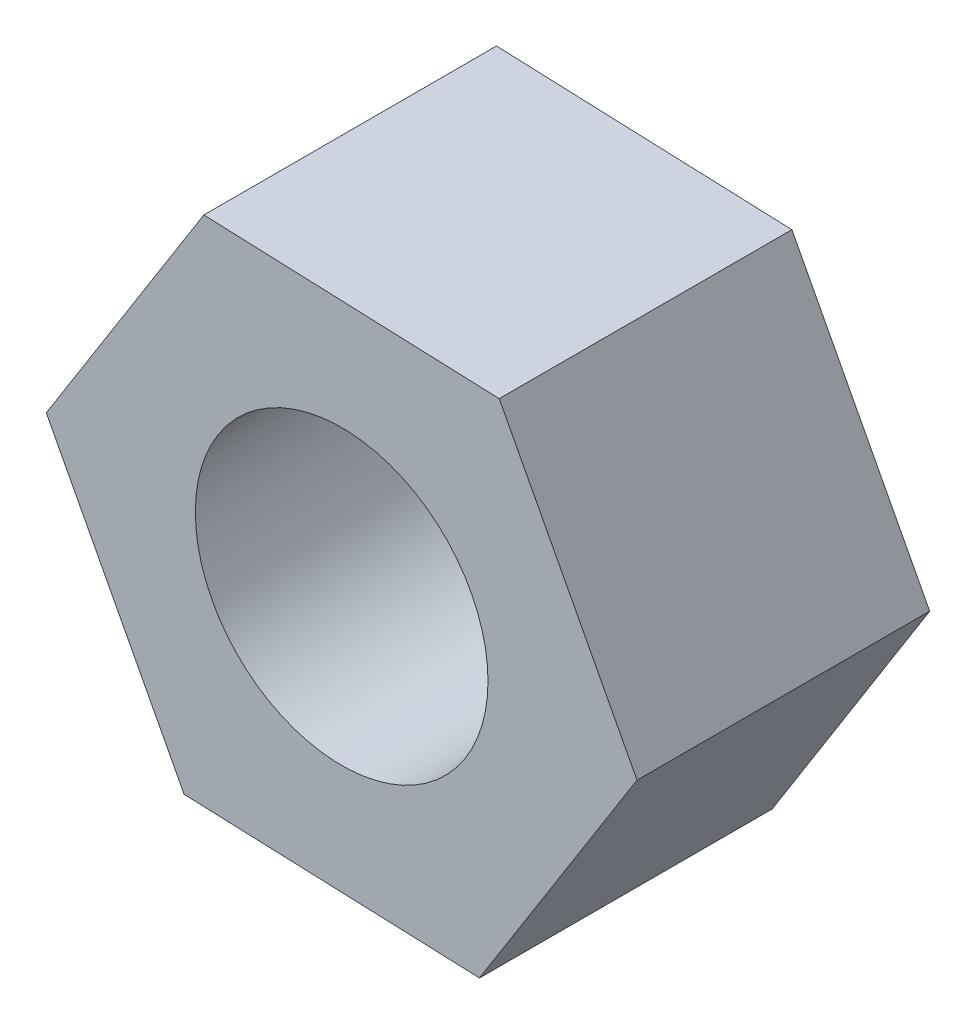
ISO-10303-21;
HEADER;
FILE_DESCRIPTION(('STEP AP214'),'2;1');
FILE_NAME('part.step','',(''),(''),'','','');
FILE_SCHEMA(('AUTOMOTIVE_DESIGN { 1 0 10303 214 1 1 1 1 }'));
ENDSEC;
DATA;
#1=APPLICATION_CONTEXT('core data for automotive mechanical design processes');
#2=APPLICATION_PROTOCOL_DEFINITION('international standard','automotive_design',2000,#1);
#3=PRODUCT_CONTEXT('',#1,'mechanical');
#4=PRODUCT('Part','Part','',(#3));
#5=PRODUCT_RELATED_PRODUCT_CATEGORY('part','',(#4));
#6=PRODUCT_DEFINITION_FORMATION('','',#4);
#7=PRODUCT_DEFINITION_CONTEXT('part definition',#1,'design');
#8=PRODUCT_DEFINITION('design','',#6,#7);
#9=PRODUCT_DEFINITION_SHAPE('','',#8);
#10=(LENGTH_UNIT() NAMED_UNIT(*) SI_UNIT(.MILLI.,.METRE.));
#11=(NAMED_UNIT(*) PLANE_ANGLE_UNIT() SI_UNIT($,.RADIAN.));
#12=(NAMED_UNIT(*) SI_UNIT($,.STERADIAN.) SOLID_ANGLE_UNIT());
#13=UNCERTAINTY_MEASURE_WITH_UNIT(LENGTH_MEASURE(1.E-05),#10,'distance_accuracy_value','');
#14=(GEOMETRIC_REPRESENTATION_CONTEXT(3) GLOBAL_UNCERTAINTY_ASSIGNED_CONTEXT((#13)) GLOBAL_UNIT_ASSIGNED_CONTEXT((#10,
#11,#12)) REPRESENTATION_CONTEXT('',''));
#15=CARTESIAN_POINT('',(0.,0.,0.));
#16=DIRECTION('',(0.,0.,1.));
#17=DIRECTION('',(1.,0.,0.));
#18=AXIS2_PLACEMENT_3D('',#15,#16,#17);
#19=CARTESIAN_POINT('',(0.,0.,4.));
#20=DIRECTION('',(0.,0.,1.));
#21=DIRECTION('',(1.,0.,0.));
#22=AXIS2_PLACEMENT_3D('',#19,#20,#21);
#23=PLANE('',#22);
#24=DIRECTION('',(0.466257066064539,-0.884649279853258,0.));
#25=VECTOR('',#24,1.);
#26=CARTESIAN_POINT('',(-4.03699942261219,0.155678071123784,4.));
#27=LINE('',#26,#25);
#28=CARTESIAN_POINT('',(-4.03699942261219,0.155678071123784,4.));
#29=VERTEX_POINT('',#28);
#30=CARTESIAN_POINT('',(-2.15332087571146,-3.41830501948338,4.));
#31=VERTEX_POINT('',#30);
#32=EDGE_CURVE('E134',#29,#31,#27,.T.);
#33=ORIENTED_EDGE('',*,*,#32,.T.);
#34=DIRECTION('',(0.9992572828248,-0.0385341760207391,0.));
#35=VECTOR('',#34,1.);
#36=CARTESIAN_POINT('',(-2.15332087571146,-3.41830501948338,4.));
#37=LINE('',#36,#35);
#38=CARTESIAN_POINT('',(1.88367854690074,-3.57398309060717,4.));
#39=VERTEX_POINT('',#38);
#40=EDGE_CURVE('E93',#31,#39,#37,.T.);
#41=ORIENTED_EDGE('',*,*,#40,.T.);
#42=DIRECTION('',(0.533000216760256,0.846115103832522,0.));
#43=VECTOR('',#42,1.);
#44=CARTESIAN_POINT('',(1.88367854690074,-3.57398309060717,4.));
#45=LINE('',#44,#43);
#46=CARTESIAN_POINT('',(4.0369994226122,-0.15567807112374,4.));
#47=VERTEX_POINT('',#46);
#48=EDGE_CURVE('E106',#39,#47,#45,.T.);
#49=ORIENTED_EDGE('',*,*,#48,.T.);
#50=DIRECTION('',(-0.466257066064549,0.884649279853253,0.));
#51=VECTOR('',#50,1.);
#52=CARTESIAN_POINT('',(4.0369994226122,-0.15567807112374,4.));
#53=LINE('',#52,#51);
#54=CARTESIAN_POINT('',(2.15332087571142,3.4183050194834,4.));
#55=VERTEX_POINT('',#54);
#56=EDGE_CURVE('E99',#47,#55,#53,.T.);
#57=ORIENTED_EDGE('',*,*,#56,.T.);
#58=DIRECTION('',(-0.999257282824801,0.0385341760207278,0.));
#59=VECTOR('',#58,1.);
#60=CARTESIAN_POINT('',(2.15332087571142,3.4183050194834,4.));
#61=LINE('',#60,#59);
#62=CARTESIAN_POINT('',(-1.88367854690078,3.57398309060715,4.));
#63=VERTEX_POINT('',#62);
#64=EDGE_CURVE('E101',#55,#63,#61,.T.);
#65=ORIENTED_EDGE('',*,*,#64,.T.);
#66=DIRECTION('',(-0.533000216760256,-0.846115103832523,0.));
#67=VECTOR('',#66,1.);
#68=CARTESIAN_POINT('',(-1.88367854690078,3.57398309060715,4.));
#69=LINE('',#68,#67);
#70=EDGE_CURVE('E57',#63,#29,#69,.T.);
#71=ORIENTED_EDGE('',*,*,#70,.T.);
#72=EDGE_LOOP('',(#33,#41,#49,#57,#65,#71));
#73=FACE_BOUND('',#72,.T.);
#74=CARTESIAN_POINT('',(0.,0.,4.));
#75=DIRECTION('',(0.,0.,1.));
#76=DIRECTION('',(1.,0.,0.));
#77=AXIS2_PLACEMENT_3D('',#74,#75,#76);
#78=CIRCLE('',#77,2.);
#79=CARTESIAN_POINT('',(2.,0.,4.));
#80=VERTEX_POINT('',#79);
#81=EDGE_CURVE('E126',#80,#80,#78,.T.);
#82=ORIENTED_EDGE('',*,*,#81,.F.);
#83=EDGE_LOOP('',(#82));
#84=FACE_BOUND('',#83,.T.);
#85=ADVANCED_FACE('F39',(#73,#84),#23,.T.);
#86=CARTESIAN_POINT('',(0.,0.,0.));
#87=DIRECTION('',(0.,0.,1.));
#88=DIRECTION('',(1.,0.,0.));
#89=AXIS2_PLACEMENT_3D('',#86,#87,#88);
#90=PLANE('',#89);
#91=DIRECTION('',(0.466257066064539,-0.884649279853258,0.));
#92=VECTOR('',#91,1.);
#93=CARTESIAN_POINT('',(-4.03699942261219,0.155678071123784,0.));
#94=LINE('',#93,#92);
#95=CARTESIAN_POINT('',(-4.03699942261219,0.155678071123784,0.));
#96=VERTEX_POINT('',#95);
#97=CARTESIAN_POINT('',(-2.15332087571146,-3.41830501948338,0.));
#98=VERTEX_POINT('',#97);
#99=EDGE_CURVE('E125',#96,#98,#94,.T.);
#100=ORIENTED_EDGE('',*,*,#99,.F.);
#101=DIRECTION('',(-0.533000216760256,-0.846115103832523,0.));
#102=VECTOR('',#101,1.);
#103=CARTESIAN_POINT('',(-1.88367854690078,3.57398309060715,0.));
#104=LINE('',#103,#102);
#105=CARTESIAN_POINT('',(-1.88367854690078,3.57398309060715,0.));
#106=VERTEX_POINT('',#105);
#107=EDGE_CURVE('E82',#106,#96,#104,.T.);
#108=ORIENTED_EDGE('',*,*,#107,.F.);
#109=DIRECTION('',(-0.999257282824801,0.0385341760207278,0.));
#110=VECTOR('',#109,1.);
#111=CARTESIAN_POINT('',(2.15332087571142,3.4183050194834,0.));
#112=LINE('',#111,#110);
#113=CARTESIAN_POINT('',(2.15332087571142,3.4183050194834,0.));
#114=VERTEX_POINT('',#113);
#115=EDGE_CURVE('E80',#114,#106,#112,.T.);
#116=ORIENTED_EDGE('',*,*,#115,.F.);
#117=DIRECTION('',(-0.466257066064549,0.884649279853253,0.));
#118=VECTOR('',#117,1.);
#119=CARTESIAN_POINT('',(4.0369994226122,-0.15567807112374,0.));
#120=LINE('',#119,#118);
#121=CARTESIAN_POINT('',(4.0369994226122,-0.15567807112374,0.));
#122=VERTEX_POINT('',#121);
#123=EDGE_CURVE('E114',#122,#114,#120,.T.);
#124=ORIENTED_EDGE('',*,*,#123,.F.);
#125=DIRECTION('',(0.533000216760256,0.846115103832522,0.));
#126=VECTOR('',#125,1.);
#127=CARTESIAN_POINT('',(1.88367854690074,-3.57398309060717,0.));
#128=LINE('',#127,#126);
#129=CARTESIAN_POINT('',(1.88367854690074,-3.57398309060717,0.));
#130=VERTEX_POINT('',#129);
#131=EDGE_CURVE('E127',#130,#122,#128,.T.);
#132=ORIENTED_EDGE('',*,*,#131,.F.);
#133=DIRECTION('',(0.9992572828248,-0.0385341760207391,0.));
#134=VECTOR('',#133,1.);
#135=CARTESIAN_POINT('',(-2.15332087571146,-3.41830501948338,0.));
#136=LINE('',#135,#134);
#137=EDGE_CURVE('E130',#98,#130,#136,.T.);
#138=ORIENTED_EDGE('',*,*,#137,.F.);
#139=EDGE_LOOP('',(#100,#108,#116,#124,#132,#138));
#140=FACE_BOUND('',#139,.T.);
#141=CARTESIAN_POINT('',(0.,0.,0.));
#142=DIRECTION('',(0.,0.,1.));
#143=DIRECTION('',(1.,0.,0.));
#144=AXIS2_PLACEMENT_3D('',#141,#142,#143);
#145=CIRCLE('',#144,2.);
#146=CARTESIAN_POINT('',(2.,0.,0.));
#147=VERTEX_POINT('',#146);
#148=EDGE_CURVE('E228',#147,#147,#145,.T.);
#149=ORIENTED_EDGE('',*,*,#148,.T.);
#150=EDGE_LOOP('',(#149));
#151=FACE_BOUND('',#150,.T.);
#152=ADVANCED_FACE('F143',(#140,#151),#90,.F.);
#153=CARTESIAN_POINT('',(-4.03699942261219,0.155678071123784,4.));
#154=DIRECTION('',(0.884649279853258,0.466257066064539,0.));
#155=DIRECTION('',(-0.466257066064539,0.884649279853258,0.));
#156=AXIS2_PLACEMENT_3D('',#153,#154,#155);
#157=PLANE('',#156);
#158=ORIENTED_EDGE('',*,*,#99,.T.);
#159=DIRECTION('',(0.,0.,-1.));
#160=VECTOR('',#159,1.);
#161=CARTESIAN_POINT('',(-2.15332087571146,-3.41830501948338,4.));
#162=LINE('',#161,#160);
#163=EDGE_CURVE('E11',#31,#98,#162,.T.);
#164=ORIENTED_EDGE('',*,*,#163,.F.);
#165=ORIENTED_EDGE('',*,*,#32,.F.);
#166=DIRECTION('',(0.,0.,-1.));
#167=VECTOR('',#166,1.);
#168=CARTESIAN_POINT('',(-4.03699942261219,0.155678071123784,4.));
#169=LINE('',#168,#167);
#170=EDGE_CURVE('E120',#29,#96,#169,.T.);
#171=ORIENTED_EDGE('',*,*,#170,.T.);
#172=EDGE_LOOP('',(#158,#164,#165,#171));
#173=FACE_BOUND('',#172,.T.);
#174=ADVANCED_FACE('F41',(#173),#157,.F.);
#175=CARTESIAN_POINT('',(-2.15332087571146,-3.41830501948338,4.));
#176=DIRECTION('',(0.0385341760207391,0.9992572828248,0.));
#177=DIRECTION('',(-0.9992572828248,0.0385341760207391,0.));
#178=AXIS2_PLACEMENT_3D('',#175,#176,#177);
#179=PLANE('',#178);
#180=ORIENTED_EDGE('',*,*,#137,.T.);
#181=DIRECTION('',(0.,0.,-1.));
#182=VECTOR('',#181,1.);
#183=CARTESIAN_POINT('',(1.88367854690074,-3.57398309060717,4.));
#184=LINE('',#183,#182);
#185=EDGE_CURVE('E48',#39,#130,#184,.T.);
#186=ORIENTED_EDGE('',*,*,#185,.F.);
#187=ORIENTED_EDGE('',*,*,#40,.F.);
#188=ORIENTED_EDGE('',*,*,#163,.T.);
#189=EDGE_LOOP('',(#180,#186,#187,#188));
#190=FACE_BOUND('',#189,.T.);
#191=ADVANCED_FACE('F170',(#190),#179,.F.);
#192=CARTESIAN_POINT('',(1.88367854690074,-3.57398309060717,4.));
#193=DIRECTION('',(-0.846115103832522,0.533000216760256,0.));
#194=DIRECTION('',(-0.533000216760256,-0.846115103832522,0.));
#195=AXIS2_PLACEMENT_3D('',#192,#193,#194);
#196=PLANE('',#195);
#197=ORIENTED_EDGE('',*,*,#131,.T.);
#198=DIRECTION('',(0.,0.,-1.));
#199=VECTOR('',#198,1.);
#200=CARTESIAN_POINT('',(4.0369994226122,-0.15567807112374,4.));
#201=LINE('',#200,#199);
#202=EDGE_CURVE('E113',#47,#122,#201,.T.);
#203=ORIENTED_EDGE('',*,*,#202,.F.);
#204=ORIENTED_EDGE('',*,*,#48,.F.);
#205=ORIENTED_EDGE('',*,*,#185,.T.);
#206=EDGE_LOOP('',(#197,#203,#204,#205));
#207=FACE_BOUND('',#206,.T.);
#208=ADVANCED_FACE('F141',(#207),#196,.F.);
#209=CARTESIAN_POINT('',(4.0369994226122,-0.15567807112374,4.));
#210=DIRECTION('',(-0.884649279853253,-0.466257066064549,0.));
#211=DIRECTION('',(0.466257066064549,-0.884649279853253,0.));
#212=AXIS2_PLACEMENT_3D('',#209,#210,#211);
#213=PLANE('',#212);
#214=ORIENTED_EDGE('',*,*,#123,.T.);
#215=DIRECTION('',(0.,0.,-1.));
#216=VECTOR('',#215,1.);
#217=CARTESIAN_POINT('',(2.15332087571142,3.4183050194834,4.));
#218=LINE('',#217,#216);
#219=EDGE_CURVE('E112',#55,#114,#218,.T.);
#220=ORIENTED_EDGE('',*,*,#219,.F.);
#221=ORIENTED_EDGE('',*,*,#56,.F.);
#222=ORIENTED_EDGE('',*,*,#202,.T.);
#223=EDGE_LOOP('',(#214,#220,#221,#222));
#224=FACE_BOUND('',#223,.T.);
#225=ADVANCED_FACE('F115',(#224),#213,.F.);
#226=CARTESIAN_POINT('',(2.15332087571142,3.4183050194834,4.));
#227=DIRECTION('',(-0.0385341760207278,-0.999257282824801,0.));
#228=DIRECTION('',(0.999257282824801,-0.0385341760207278,0.));
#229=AXIS2_PLACEMENT_3D('',#226,#227,#228);
#230=PLANE('',#229);
#231=ORIENTED_EDGE('',*,*,#115,.T.);
#232=DIRECTION('',(0.,0.,-1.));
#233=VECTOR('',#232,1.);
#234=CARTESIAN_POINT('',(-1.88367854690078,3.57398309060715,4.));
#235=LINE('',#234,#233);
#236=EDGE_CURVE('E116',#63,#106,#235,.T.);
#237=ORIENTED_EDGE('',*,*,#236,.F.);
#238=ORIENTED_EDGE('',*,*,#64,.F.);
#239=ORIENTED_EDGE('',*,*,#219,.T.);
#240=EDGE_LOOP('',(#231,#237,#238,#239));
#241=FACE_BOUND('',#240,.T.);
#242=ADVANCED_FACE('F119',(#241),#230,.F.);
#243=CARTESIAN_POINT('',(-1.88367854690078,3.57398309060715,4.));
#244=DIRECTION('',(0.846115103832523,-0.533000216760256,0.));
#245=DIRECTION('',(0.533000216760256,0.846115103832523,0.));
#246=AXIS2_PLACEMENT_3D('',#243,#244,#245);
#247=PLANE('',#246);
#248=ORIENTED_EDGE('',*,*,#107,.T.);
#249=ORIENTED_EDGE('',*,*,#170,.F.);
#250=ORIENTED_EDGE('',*,*,#70,.F.);
#251=ORIENTED_EDGE('',*,*,#236,.T.);
#252=EDGE_LOOP('',(#248,#249,#250,#251));
#253=FACE_BOUND('',#252,.T.);
#254=ADVANCED_FACE('F146',(#253),#247,.F.);
#255=CARTESIAN_POINT('',(0.,0.,4.));
#256=DIRECTION('',(0.,0.,-1.));
#257=DIRECTION('',(-1.,0.,0.));
#258=AXIS2_PLACEMENT_3D('',#255,#256,#257);
#259=CYLINDRICAL_SURFACE('',#258,2.);
#260=ORIENTED_EDGE('',*,*,#81,.T.);
#261=EDGE_LOOP('',(#260));
#262=FACE_BOUND('',#261,.T.);
#263=ORIENTED_EDGE('',*,*,#148,.F.);
#264=EDGE_LOOP('',(#263));
#265=FACE_BOUND('',#264,.T.);
#266=ADVANCED_FACE('F151',(#262,#265),#259,.F.);
#267=CLOSED_SHELL('',(#85,#152,#174,#191,#208,#225,#242,#254,#266));
#268=MANIFOLD_SOLID_BREP('B2',#267);
#269=ADVANCED_BREP_SHAPE_REPRESENTATION('',(#18,#268),#14);
#270=SHAPE_DEFINITION_REPRESENTATION(#9,#269);
ENDSEC;
END-ISO-10303-21;
